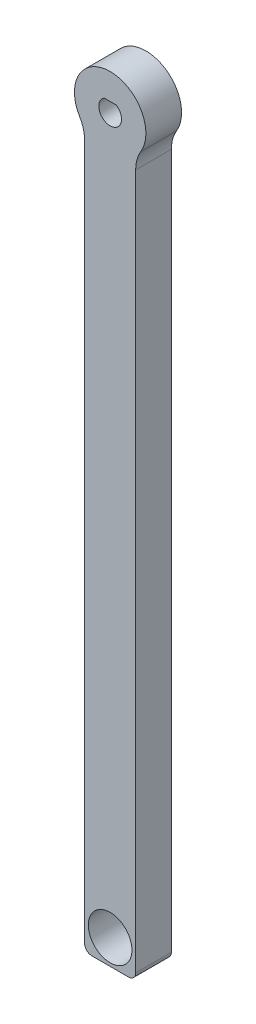
ISO-10303-21;
HEADER;
FILE_DESCRIPTION(('STEP AP214'),'2;1');
FILE_NAME('part.step','',(''),(''),'','','');
FILE_SCHEMA(('AUTOMOTIVE_DESIGN { 1 0 10303 214 1 1 1 1 }'));
ENDSEC;
DATA;
#1=APPLICATION_CONTEXT('core data for automotive mechanical design processes');
#2=APPLICATION_PROTOCOL_DEFINITION('international standard','automotive_design',2000,#1);
#3=PRODUCT_CONTEXT('',#1,'mechanical');
#4=PRODUCT('Part','Part','',(#3));
#5=PRODUCT_RELATED_PRODUCT_CATEGORY('part','',(#4));
#6=PRODUCT_DEFINITION_FORMATION('','',#4);
#7=PRODUCT_DEFINITION_CONTEXT('part definition',#1,'design');
#8=PRODUCT_DEFINITION('design','',#6,#7);
#9=PRODUCT_DEFINITION_SHAPE('','',#8);
#10=(LENGTH_UNIT() NAMED_UNIT(*) SI_UNIT(.MILLI.,.METRE.));
#11=(NAMED_UNIT(*) PLANE_ANGLE_UNIT() SI_UNIT($,.RADIAN.));
#12=(NAMED_UNIT(*) SI_UNIT($,.STERADIAN.) SOLID_ANGLE_UNIT());
#13=UNCERTAINTY_MEASURE_WITH_UNIT(LENGTH_MEASURE(1.E-05),#10,'distance_accuracy_value','');
#14=(GEOMETRIC_REPRESENTATION_CONTEXT(3) GLOBAL_UNCERTAINTY_ASSIGNED_CONTEXT((#13)) GLOBAL_UNIT_ASSIGNED_CONTEXT((#10,
#11,#12)) REPRESENTATION_CONTEXT('',''));
#15=CARTESIAN_POINT('',(0.,0.,0.));
#16=DIRECTION('',(0.,0.,1.));
#17=DIRECTION('',(1.,0.,0.));
#18=AXIS2_PLACEMENT_3D('',#15,#16,#17);
#19=CARTESIAN_POINT('',(0.,0.,10.));
#20=DIRECTION('',(0.,0.,-1.));
#21=DIRECTION('',(-1.,0.,0.));
#22=AXIS2_PLACEMENT_3D('',#19,#20,#21);
#23=CYLINDRICAL_SURFACE('',#22,10.);
#24=CARTESIAN_POINT('',(0.,0.,0.));
#25=DIRECTION('',(0.,0.,1.));
#26=DIRECTION('',(1.,0.,0.));
#27=AXIS2_PLACEMENT_3D('',#24,#25,#26);
#28=CIRCLE('',#27,10.);
#29=CARTESIAN_POINT('',(8.57071421427143,-5.15197611187064,0.));
#30=VERTEX_POINT('',#29);
#31=CARTESIAN_POINT('',(-8.57071421427143,-5.15197611187064,0.));
#32=VERTEX_POINT('',#31);
#33=EDGE_CURVE('E143',#30,#32,#28,.T.);
#34=ORIENTED_EDGE('',*,*,#33,.T.);
#35=DIRECTION('',(0.,0.,-1.));
#36=VECTOR('',#35,1.);
#37=CARTESIAN_POINT('',(-8.57071421427143,-5.15197611187064,10.));
#38=LINE('',#37,#36);
#39=CARTESIAN_POINT('',(-8.57071421427143,-5.15197611187064,10.));
#40=VERTEX_POINT('',#39);
#41=EDGE_CURVE('E169',#32,#40,#38,.F.);
#42=ORIENTED_EDGE('',*,*,#41,.T.);
#43=CARTESIAN_POINT('',(0.,0.,10.));
#44=DIRECTION('',(0.,0.,1.));
#45=DIRECTION('',(1.,0.,0.));
#46=AXIS2_PLACEMENT_3D('',#43,#44,#45);
#47=CIRCLE('',#46,10.);
#48=CARTESIAN_POINT('',(8.57071421427143,-5.15197611187064,10.));
#49=VERTEX_POINT('',#48);
#50=EDGE_CURVE('E138',#49,#40,#47,.T.);
#51=ORIENTED_EDGE('',*,*,#50,.F.);
#52=DIRECTION('',(0.,0.,-1.));
#53=VECTOR('',#52,1.);
#54=CARTESIAN_POINT('',(8.57071421427143,-5.15197611187064,10.));
#55=LINE('',#54,#53);
#56=EDGE_CURVE('E165',#49,#30,#55,.T.);
#57=ORIENTED_EDGE('',*,*,#56,.T.);
#58=EDGE_LOOP('',(#34,#42,#51,#57));
#59=FACE_BOUND('',#58,.T.);
#60=ADVANCED_FACE('F41',(#59),#23,.T.);
#61=CARTESIAN_POINT('',(0.,0.,10.));
#62=DIRECTION('',(0.,0.,1.));
#63=DIRECTION('',(1.,0.,0.));
#64=AXIS2_PLACEMENT_3D('',#61,#62,#63);
#65=PLANE('',#64);
#66=CARTESIAN_POINT('',(0.,-200.,10.));
#67=DIRECTION('',(0.,0.,-1.));
#68=DIRECTION('',(-1.,0.,0.));
#69=AXIS2_PLACEMENT_3D('',#66,#67,#68);
#70=CIRCLE('',#69,6.11);
#71=CARTESIAN_POINT('',(-6.11,-200.,10.));
#72=VERTEX_POINT('',#71);
#73=EDGE_CURVE('E222',#72,#72,#70,.T.);
#74=ORIENTED_EDGE('',*,*,#73,.T.);
#75=EDGE_LOOP('',(#74));
#76=FACE_BOUND('',#75,.T.);
#77=CARTESIAN_POINT('',(0.,0.,10.));
#78=DIRECTION('',(0.,0.,1.));
#79=DIRECTION('',(1.,0.,0.));
#80=AXIS2_PLACEMENT_3D('',#77,#78,#79);
#81=CIRCLE('',#80,3.19);
#82=CARTESIAN_POINT('',(-1.66664333317,2.72,10.));
#83=VERTEX_POINT('',#82);
#84=CARTESIAN_POINT('',(1.66664333317,2.72,10.));
#85=VERTEX_POINT('',#84);
#86=EDGE_CURVE('E123',#83,#85,#81,.T.);
#87=ORIENTED_EDGE('',*,*,#86,.F.);
#88=DIRECTION('',(1.,0.,0.));
#89=VECTOR('',#88,1.);
#90=CARTESIAN_POINT('',(0.,2.72,10.));
#91=LINE('',#90,#89);
#92=EDGE_CURVE('E134',#83,#85,#91,.T.);
#93=ORIENTED_EDGE('',*,*,#92,.T.);
#94=EDGE_LOOP('',(#87,#93));
#95=FACE_BOUND('',#94,.T.);
#96=DIRECTION('',(-1.,0.,0.));
#97=VECTOR('',#96,1.);
#98=CARTESIAN_POINT('',(7.14142842854285,-207.,10.));
#99=LINE('',#98,#97);
#100=CARTESIAN_POINT('',(5.14142842854285,-207.,10.));
#101=VERTEX_POINT('',#100);
#102=CARTESIAN_POINT('',(-5.14142842854285,-207.,10.));
#103=VERTEX_POINT('',#102);
#104=EDGE_CURVE('E221',#101,#103,#99,.T.);
#105=ORIENTED_EDGE('',*,*,#104,.F.);
#106=CARTESIAN_POINT('',(5.14142842854285,-205.,10.));
#107=DIRECTION('',(0.,0.,1.));
#108=DIRECTION('',(1.,0.,0.));
#109=AXIS2_PLACEMENT_3D('',#106,#107,#108);
#110=CIRCLE('',#109,2.);
#111=CARTESIAN_POINT('',(7.14142842854285,-205.,10.));
#112=VERTEX_POINT('',#111);
#113=EDGE_CURVE('E201',#101,#112,#110,.T.);
#114=ORIENTED_EDGE('',*,*,#113,.T.);
#115=DIRECTION('',(0.,1.,0.));
#116=VECTOR('',#115,1.);
#117=CARTESIAN_POINT('',(7.14142842854285,-207.,10.));
#118=LINE('',#117,#116);
#119=CARTESIAN_POINT('',(7.14142842854285,-10.3039522237413,10.));
#120=VERTEX_POINT('',#119);
#121=EDGE_CURVE('E225',#112,#120,#118,.T.);
#122=ORIENTED_EDGE('',*,*,#121,.T.);
#123=CARTESIAN_POINT('',(17.1414284285429,-10.3039522237413,10.));
#124=DIRECTION('',(0.,0.,1.));
#125=DIRECTION('',(1.,0.,0.));
#126=AXIS2_PLACEMENT_3D('',#123,#124,#125);
#127=CIRCLE('',#126,10.);
#128=EDGE_CURVE('E187',#120,#49,#127,.F.);
#129=ORIENTED_EDGE('',*,*,#128,.T.);
#130=ORIENTED_EDGE('',*,*,#50,.T.);
#131=CARTESIAN_POINT('',(-17.1414284285429,-10.3039522237413,10.));
#132=DIRECTION('',(0.,0.,1.));
#133=DIRECTION('',(1.,0.,0.));
#134=AXIS2_PLACEMENT_3D('',#131,#132,#133);
#135=CIRCLE('',#134,10.);
#136=CARTESIAN_POINT('',(-7.14142842854285,-10.3039522237413,10.));
#137=VERTEX_POINT('',#136);
#138=EDGE_CURVE('E179',#40,#137,#135,.F.);
#139=ORIENTED_EDGE('',*,*,#138,.T.);
#140=DIRECTION('',(0.,1.,0.));
#141=VECTOR('',#140,1.);
#142=CARTESIAN_POINT('',(-7.14142842854285,-207.,10.));
#143=LINE('',#142,#141);
#144=CARTESIAN_POINT('',(-7.14142842854285,-205.,10.));
#145=VERTEX_POINT('',#144);
#146=EDGE_CURVE('E230',#145,#137,#143,.T.);
#147=ORIENTED_EDGE('',*,*,#146,.F.);
#148=CARTESIAN_POINT('',(-5.14142842854285,-205.,10.));
#149=DIRECTION('',(0.,0.,1.));
#150=DIRECTION('',(1.,0.,0.));
#151=AXIS2_PLACEMENT_3D('',#148,#149,#150);
#152=CIRCLE('',#151,2.);
#153=EDGE_CURVE('E198',#145,#103,#152,.T.);
#154=ORIENTED_EDGE('',*,*,#153,.T.);
#155=EDGE_LOOP('',(#105,#114,#122,#129,#130,#139,#147,#154));
#156=FACE_BOUND('',#155,.T.);
#157=ADVANCED_FACE('F140',(#76,#95,#156),#65,.T.);
#158=CARTESIAN_POINT('',(0.,0.,0.));
#159=DIRECTION('',(0.,0.,1.));
#160=DIRECTION('',(1.,0.,0.));
#161=AXIS2_PLACEMENT_3D('',#158,#159,#160);
#162=PLANE('',#161);
#163=CARTESIAN_POINT('',(0.,-200.,0.));
#164=DIRECTION('',(0.,0.,-1.));
#165=DIRECTION('',(-1.,0.,0.));
#166=AXIS2_PLACEMENT_3D('',#163,#164,#165);
#167=CIRCLE('',#166,6.11);
#168=CARTESIAN_POINT('',(-6.11,-200.,0.));
#169=VERTEX_POINT('',#168);
#170=EDGE_CURVE('E238',#169,#169,#167,.T.);
#171=ORIENTED_EDGE('',*,*,#170,.F.);
#172=EDGE_LOOP('',(#171));
#173=FACE_BOUND('',#172,.T.);
#174=CARTESIAN_POINT('',(0.,0.,0.));
#175=DIRECTION('',(0.,0.,1.));
#176=DIRECTION('',(1.,0.,0.));
#177=AXIS2_PLACEMENT_3D('',#174,#175,#176);
#178=CIRCLE('',#177,3.19);
#179=CARTESIAN_POINT('',(-1.66664333317,2.72,0.));
#180=VERTEX_POINT('',#179);
#181=CARTESIAN_POINT('',(1.66664333317,2.72,0.));
#182=VERTEX_POINT('',#181);
#183=EDGE_CURVE('E125',#180,#182,#178,.T.);
#184=ORIENTED_EDGE('',*,*,#183,.T.);
#185=DIRECTION('',(1.,0.,0.));
#186=VECTOR('',#185,1.);
#187=CARTESIAN_POINT('',(0.,2.72,0.));
#188=LINE('',#187,#186);
#189=EDGE_CURVE('E147',#180,#182,#188,.T.);
#190=ORIENTED_EDGE('',*,*,#189,.F.);
#191=EDGE_LOOP('',(#184,#190));
#192=FACE_BOUND('',#191,.T.);
#193=DIRECTION('',(0.,1.,0.));
#194=VECTOR('',#193,1.);
#195=CARTESIAN_POINT('',(7.14142842854285,-207.,0.));
#196=LINE('',#195,#194);
#197=CARTESIAN_POINT('',(7.14142842854285,-205.,0.));
#198=VERTEX_POINT('',#197);
#199=CARTESIAN_POINT('',(7.14142842854285,-10.3039522237413,0.));
#200=VERTEX_POINT('',#199);
#201=EDGE_CURVE('E212',#198,#200,#196,.T.);
#202=ORIENTED_EDGE('',*,*,#201,.F.);
#203=CARTESIAN_POINT('',(5.14142842854285,-205.,0.));
#204=DIRECTION('',(0.,0.,1.));
#205=DIRECTION('',(1.,0.,0.));
#206=AXIS2_PLACEMENT_3D('',#203,#204,#205);
#207=CIRCLE('',#206,2.);
#208=CARTESIAN_POINT('',(5.14142842854285,-207.,0.));
#209=VERTEX_POINT('',#208);
#210=EDGE_CURVE('E50',#198,#209,#207,.F.);
#211=ORIENTED_EDGE('',*,*,#210,.T.);
#212=DIRECTION('',(1.,0.,0.));
#213=VECTOR('',#212,1.);
#214=CARTESIAN_POINT('',(-7.14142842854285,-207.,0.));
#215=LINE('',#214,#213);
#216=CARTESIAN_POINT('',(-5.14142842854285,-207.,0.));
#217=VERTEX_POINT('',#216);
#218=EDGE_CURVE('E211',#217,#209,#215,.T.);
#219=ORIENTED_EDGE('',*,*,#218,.F.);
#220=CARTESIAN_POINT('',(-5.14142842854285,-205.,0.));
#221=DIRECTION('',(0.,0.,1.));
#222=DIRECTION('',(1.,0.,0.));
#223=AXIS2_PLACEMENT_3D('',#220,#221,#222);
#224=CIRCLE('',#223,2.);
#225=CARTESIAN_POINT('',(-7.14142842854285,-205.,0.));
#226=VERTEX_POINT('',#225);
#227=EDGE_CURVE('E57',#217,#226,#224,.F.);
#228=ORIENTED_EDGE('',*,*,#227,.T.);
#229=DIRECTION('',(0.,1.,0.));
#230=VECTOR('',#229,1.);
#231=CARTESIAN_POINT('',(-7.14142842854285,-207.,0.));
#232=LINE('',#231,#230);
#233=CARTESIAN_POINT('',(-7.14142842854285,-10.3039522237413,0.));
#234=VERTEX_POINT('',#233);
#235=EDGE_CURVE('E150',#226,#234,#232,.T.);
#236=ORIENTED_EDGE('',*,*,#235,.T.);
#237=CARTESIAN_POINT('',(-17.1414284285429,-10.3039522237413,0.));
#238=DIRECTION('',(0.,0.,1.));
#239=DIRECTION('',(1.,0.,0.));
#240=AXIS2_PLACEMENT_3D('',#237,#238,#239);
#241=CIRCLE('',#240,10.);
#242=EDGE_CURVE('E176',#234,#32,#241,.T.);
#243=ORIENTED_EDGE('',*,*,#242,.T.);
#244=ORIENTED_EDGE('',*,*,#33,.F.);
#245=CARTESIAN_POINT('',(17.1414284285429,-10.3039522237413,0.));
#246=DIRECTION('',(0.,0.,1.));
#247=DIRECTION('',(1.,0.,0.));
#248=AXIS2_PLACEMENT_3D('',#245,#246,#247);
#249=CIRCLE('',#248,10.);
#250=EDGE_CURVE('E183',#30,#200,#249,.T.);
#251=ORIENTED_EDGE('',*,*,#250,.T.);
#252=EDGE_LOOP('',(#202,#211,#219,#228,#236,#243,#244,#251));
#253=FACE_BOUND('',#252,.T.);
#254=ADVANCED_FACE('F210',(#173,#192,#253),#162,.F.);
#255=CARTESIAN_POINT('',(0.,0.,10.));
#256=DIRECTION('',(0.,0.,-1.));
#257=DIRECTION('',(-1.,0.,0.));
#258=AXIS2_PLACEMENT_3D('',#255,#256,#257);
#259=CYLINDRICAL_SURFACE('',#258,3.19);
#260=ORIENTED_EDGE('',*,*,#183,.F.);
#261=DIRECTION('',(0.,0.,-1.));
#262=VECTOR('',#261,1.);
#263=CARTESIAN_POINT('',(-1.66664333317,2.72,10.));
#264=LINE('',#263,#262);
#265=EDGE_CURVE('E119',#83,#180,#264,.T.);
#266=ORIENTED_EDGE('',*,*,#265,.F.);
#267=ORIENTED_EDGE('',*,*,#86,.T.);
#268=DIRECTION('',(0.,0.,-1.));
#269=VECTOR('',#268,1.);
#270=CARTESIAN_POINT('',(1.66664333317,2.72,10.));
#271=LINE('',#270,#269);
#272=EDGE_CURVE('E131',#85,#182,#271,.T.);
#273=ORIENTED_EDGE('',*,*,#272,.T.);
#274=EDGE_LOOP('',(#260,#266,#267,#273));
#275=FACE_BOUND('',#274,.T.);
#276=ADVANCED_FACE('F121',(#275),#259,.F.);
#277=CARTESIAN_POINT('',(0.,2.72,10.));
#278=DIRECTION('',(0.,1.,0.));
#279=DIRECTION('',(0.,0.,1.));
#280=AXIS2_PLACEMENT_3D('',#277,#278,#279);
#281=PLANE('',#280);
#282=ORIENTED_EDGE('',*,*,#189,.T.);
#283=ORIENTED_EDGE('',*,*,#272,.F.);
#284=ORIENTED_EDGE('',*,*,#92,.F.);
#285=ORIENTED_EDGE('',*,*,#265,.T.);
#286=EDGE_LOOP('',(#282,#283,#284,#285));
#287=FACE_BOUND('',#286,.T.);
#288=ADVANCED_FACE('F135',(#287),#281,.F.);
#289=CARTESIAN_POINT('',(-7.14142842854285,-207.,10.));
#290=DIRECTION('',(1.,0.,0.));
#291=DIRECTION('',(0.,0.,-1.));
#292=AXIS2_PLACEMENT_3D('',#289,#290,#291);
#293=PLANE('',#292);
#294=ORIENTED_EDGE('',*,*,#235,.F.);
#295=DIRECTION('',(0.,0.,-1.));
#296=VECTOR('',#295,1.);
#297=CARTESIAN_POINT('',(-7.14142842854285,-205.,10.));
#298=LINE('',#297,#296);
#299=EDGE_CURVE('E11',#226,#145,#298,.F.);
#300=ORIENTED_EDGE('',*,*,#299,.T.);
#301=ORIENTED_EDGE('',*,*,#146,.T.);
#302=DIRECTION('',(0.,0.,1.));
#303=VECTOR('',#302,1.);
#304=CARTESIAN_POINT('',(-7.14142842854285,-10.3039522237413,0.));
#305=LINE('',#304,#303);
#306=EDGE_CURVE('E130',#137,#234,#305,.F.);
#307=ORIENTED_EDGE('',*,*,#306,.T.);
#308=EDGE_LOOP('',(#294,#300,#301,#307));
#309=FACE_BOUND('',#308,.T.);
#310=ADVANCED_FACE('F270',(#309),#293,.F.);
#311=CARTESIAN_POINT('',(7.14142842854285,-207.,0.));
#312=DIRECTION('',(-1.,0.,0.));
#313=DIRECTION('',(0.,0.,1.));
#314=AXIS2_PLACEMENT_3D('',#311,#312,#313);
#315=PLANE('',#314);
#316=ORIENTED_EDGE('',*,*,#121,.F.);
#317=DIRECTION('',(0.,0.,1.));
#318=VECTOR('',#317,1.);
#319=CARTESIAN_POINT('',(7.14142842854285,-205.,0.));
#320=LINE('',#319,#318);
#321=EDGE_CURVE('E65',#112,#198,#320,.F.);
#322=ORIENTED_EDGE('',*,*,#321,.T.);
#323=ORIENTED_EDGE('',*,*,#201,.T.);
#324=DIRECTION('',(0.,0.,1.));
#325=VECTOR('',#324,1.);
#326=CARTESIAN_POINT('',(7.14142842854285,-10.3039522237413,10.));
#327=LINE('',#326,#325);
#328=EDGE_CURVE('E172',#200,#120,#327,.T.);
#329=ORIENTED_EDGE('',*,*,#328,.T.);
#330=EDGE_LOOP('',(#316,#322,#323,#329));
#331=FACE_BOUND('',#330,.T.);
#332=ADVANCED_FACE('F226',(#331),#315,.F.);
#333=CARTESIAN_POINT('',(0.,-207.,0.));
#334=DIRECTION('',(0.,-1.,0.));
#335=DIRECTION('',(0.,0.,-1.));
#336=AXIS2_PLACEMENT_3D('',#333,#334,#335);
#337=PLANE('',#336);
#338=ORIENTED_EDGE('',*,*,#218,.T.);
#339=DIRECTION('',(0.,0.,1.));
#340=VECTOR('',#339,1.);
#341=CARTESIAN_POINT('',(5.14142842854285,-207.,10.));
#342=LINE('',#341,#340);
#343=EDGE_CURVE('E194',#209,#101,#342,.T.);
#344=ORIENTED_EDGE('',*,*,#343,.T.);
#345=ORIENTED_EDGE('',*,*,#104,.T.);
#346=DIRECTION('',(0.,0.,-1.));
#347=VECTOR('',#346,1.);
#348=CARTESIAN_POINT('',(-5.14142842854285,-207.,0.));
#349=LINE('',#348,#347);
#350=EDGE_CURVE('E190',#103,#217,#349,.T.);
#351=ORIENTED_EDGE('',*,*,#350,.T.);
#352=EDGE_LOOP('',(#338,#344,#345,#351));
#353=FACE_BOUND('',#352,.T.);
#354=ADVANCED_FACE('F216',(#353),#337,.T.);
#355=CARTESIAN_POINT('',(0.,-200.,10.));
#356=DIRECTION('',(0.,0.,-1.));
#357=DIRECTION('',(-1.,0.,0.));
#358=AXIS2_PLACEMENT_3D('',#355,#356,#357);
#359=CYLINDRICAL_SURFACE('',#358,6.11);
#360=ORIENTED_EDGE('',*,*,#73,.F.);
#361=EDGE_LOOP('',(#360));
#362=FACE_BOUND('',#361,.T.);
#363=ORIENTED_EDGE('',*,*,#170,.T.);
#364=EDGE_LOOP('',(#363));
#365=FACE_BOUND('',#364,.T.);
#366=ADVANCED_FACE('F247',(#362,#365),#359,.F.);
#367=CARTESIAN_POINT('',(-17.1414284285429,-10.3039522237413,10.));
#368=DIRECTION('',(0.,0.,-1.));
#369=DIRECTION('',(-1.,0.,0.));
#370=AXIS2_PLACEMENT_3D('',#367,#368,#369);
#371=CYLINDRICAL_SURFACE('',#370,10.);
#372=ORIENTED_EDGE('',*,*,#138,.F.);
#373=ORIENTED_EDGE('',*,*,#41,.F.);
#374=ORIENTED_EDGE('',*,*,#242,.F.);
#375=ORIENTED_EDGE('',*,*,#306,.F.);
#376=EDGE_LOOP('',(#372,#373,#374,#375));
#377=FACE_BOUND('',#376,.T.);
#378=ADVANCED_FACE('F250',(#377),#371,.F.);
#379=CARTESIAN_POINT('',(17.1414284285429,-10.3039522237413,10.));
#380=DIRECTION('',(0.,0.,-1.));
#381=DIRECTION('',(-1.,0.,0.));
#382=AXIS2_PLACEMENT_3D('',#379,#380,#381);
#383=CYLINDRICAL_SURFACE('',#382,10.);
#384=ORIENTED_EDGE('',*,*,#128,.F.);
#385=ORIENTED_EDGE('',*,*,#328,.F.);
#386=ORIENTED_EDGE('',*,*,#250,.F.);
#387=ORIENTED_EDGE('',*,*,#56,.F.);
#388=EDGE_LOOP('',(#384,#385,#386,#387));
#389=FACE_BOUND('',#388,.T.);
#390=ADVANCED_FACE('F274',(#389),#383,.F.);
#391=CARTESIAN_POINT('',(5.14142842854285,-205.,0.));
#392=DIRECTION('',(0.,0.,-1.));
#393=DIRECTION('',(-1.,0.,0.));
#394=AXIS2_PLACEMENT_3D('',#391,#392,#393);
#395=CYLINDRICAL_SURFACE('',#394,2.);
#396=ORIENTED_EDGE('',*,*,#210,.F.);
#397=ORIENTED_EDGE('',*,*,#321,.F.);
#398=ORIENTED_EDGE('',*,*,#113,.F.);
#399=ORIENTED_EDGE('',*,*,#343,.F.);
#400=EDGE_LOOP('',(#396,#397,#398,#399));
#401=FACE_BOUND('',#400,.T.);
#402=ADVANCED_FACE('F224',(#401),#395,.T.);
#403=CARTESIAN_POINT('',(-5.14142842854285,-205.,0.));
#404=DIRECTION('',(0.,0.,1.));
#405=DIRECTION('',(1.,0.,0.));
#406=AXIS2_PLACEMENT_3D('',#403,#404,#405);
#407=CYLINDRICAL_SURFACE('',#406,2.);
#408=ORIENTED_EDGE('',*,*,#153,.F.);
#409=ORIENTED_EDGE('',*,*,#299,.F.);
#410=ORIENTED_EDGE('',*,*,#227,.F.);
#411=ORIENTED_EDGE('',*,*,#350,.F.);
#412=EDGE_LOOP('',(#408,#409,#410,#411));
#413=FACE_BOUND('',#412,.T.);
#414=ADVANCED_FACE('F43',(#413),#407,.T.);
#415=CLOSED_SHELL('',(#60,#157,#254,#276,#288,#310,#332,#354,#366,#378,#390,#402,#414));
#416=MANIFOLD_SOLID_BREP('B2',#415);
#417=ADVANCED_BREP_SHAPE_REPRESENTATION('',(#18,#416),#14);
#418=SHAPE_DEFINITION_REPRESENTATION(#9,#417);
ENDSEC;
END-ISO-10303-21;
